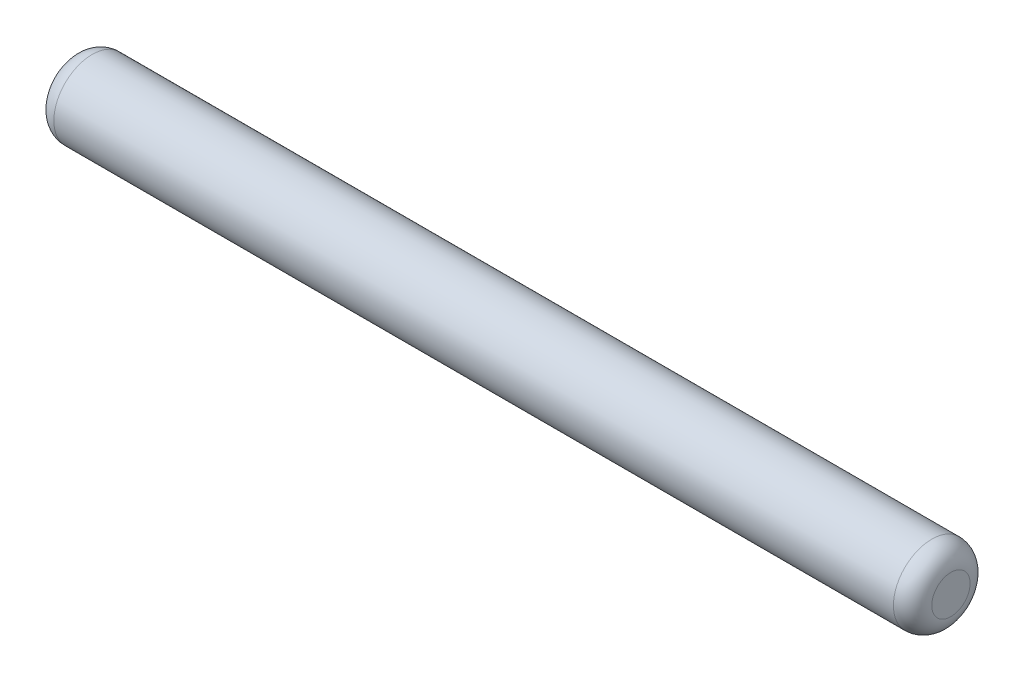
ISO-10303-21;
HEADER;
FILE_DESCRIPTION(('STEP AP214'),'2;1');
FILE_NAME('part.step','',(''),(''),'','','');
FILE_SCHEMA(('AUTOMOTIVE_DESIGN { 1 0 10303 214 1 1 1 1 }'));
ENDSEC;
DATA;
#1=APPLICATION_CONTEXT('core data for automotive mechanical design processes');
#2=APPLICATION_PROTOCOL_DEFINITION('international standard','automotive_design',2000,#1);
#3=PRODUCT_CONTEXT('',#1,'mechanical');
#4=PRODUCT('Part','Part','',(#3));
#5=PRODUCT_RELATED_PRODUCT_CATEGORY('part','',(#4));
#6=PRODUCT_DEFINITION_FORMATION('','',#4);
#7=PRODUCT_DEFINITION_CONTEXT('part definition',#1,'design');
#8=PRODUCT_DEFINITION('design','',#6,#7);
#9=PRODUCT_DEFINITION_SHAPE('','',#8);
#10=(LENGTH_UNIT() NAMED_UNIT(*) SI_UNIT(.MILLI.,.METRE.));
#11=(NAMED_UNIT(*) PLANE_ANGLE_UNIT() SI_UNIT($,.RADIAN.));
#12=(NAMED_UNIT(*) SI_UNIT($,.STERADIAN.) SOLID_ANGLE_UNIT());
#13=UNCERTAINTY_MEASURE_WITH_UNIT(LENGTH_MEASURE(1.E-05),#10,'distance_accuracy_value','');
#14=(GEOMETRIC_REPRESENTATION_CONTEXT(3) GLOBAL_UNCERTAINTY_ASSIGNED_CONTEXT((#13)) GLOBAL_UNIT_ASSIGNED_CONTEXT((#10,
#11,#12)) REPRESENTATION_CONTEXT('',''));
#15=CARTESIAN_POINT('',(0.,0.,0.));
#16=DIRECTION('',(0.,0.,1.));
#17=DIRECTION('',(1.,0.,0.));
#18=AXIS2_PLACEMENT_3D('',#15,#16,#17);
#19=CARTESIAN_POINT('',(-11.45,0.,0.));
#20=DIRECTION('',(1.,0.,0.));
#21=DIRECTION('',(0.,0.,-1.));
#22=AXIS2_PLACEMENT_3D('',#19,#20,#21);
#23=CYLINDRICAL_SURFACE('',#22,1.);
#24=CARTESIAN_POINT('',(-10.95,0.,0.));
#25=DIRECTION('',(1.,0.,0.));
#26=DIRECTION('',(0.,0.,-1.));
#27=AXIS2_PLACEMENT_3D('',#24,#25,#26);
#28=CIRCLE('',#27,1.);
#29=CARTESIAN_POINT('',(-10.95,0.,-1.));
#30=VERTEX_POINT('',#29);
#31=EDGE_CURVE('E55',#30,#30,#28,.T.);
#32=ORIENTED_EDGE('',*,*,#31,.T.);
#33=EDGE_LOOP('',(#32));
#34=FACE_BOUND('',#33,.T.);
#35=CARTESIAN_POINT('',(10.95,0.,0.));
#36=DIRECTION('',(1.,0.,0.));
#37=DIRECTION('',(0.,0.,-1.));
#38=AXIS2_PLACEMENT_3D('',#35,#36,#37);
#39=CIRCLE('',#38,1.);
#40=CARTESIAN_POINT('',(10.95,0.,-1.));
#41=VERTEX_POINT('',#40);
#42=EDGE_CURVE('E59',#41,#41,#39,.F.);
#43=ORIENTED_EDGE('',*,*,#42,.T.);
#44=EDGE_LOOP('',(#43));
#45=FACE_BOUND('',#44,.T.);
#46=ADVANCED_FACE('F44',(#34,#45),#23,.T.);
#47=CARTESIAN_POINT('',(-11.45,0.,0.));
#48=DIRECTION('',(1.,0.,0.));
#49=DIRECTION('',(0.,0.,-1.));
#50=AXIS2_PLACEMENT_3D('',#47,#48,#49);
#51=PLANE('',#50);
#52=CARTESIAN_POINT('',(-11.45,0.,0.));
#53=DIRECTION('',(1.,0.,0.));
#54=DIRECTION('',(0.,0.,-1.));
#55=AXIS2_PLACEMENT_3D('',#52,#53,#54);
#56=CIRCLE('',#55,0.5);
#57=CARTESIAN_POINT('',(-11.45,0.,-0.5));
#58=VERTEX_POINT('',#57);
#59=EDGE_CURVE('E51',#58,#58,#56,.F.);
#60=ORIENTED_EDGE('',*,*,#59,.T.);
#61=EDGE_LOOP('',(#60));
#62=FACE_BOUND('',#61,.T.);
#63=ADVANCED_FACE('F75',(#62),#51,.F.);
#64=CARTESIAN_POINT('',(11.45,0.,0.));
#65=DIRECTION('',(1.,0.,0.));
#66=DIRECTION('',(0.,0.,-1.));
#67=AXIS2_PLACEMENT_3D('',#64,#65,#66);
#68=PLANE('',#67);
#69=CARTESIAN_POINT('',(11.45,0.,0.));
#70=DIRECTION('',(1.,0.,0.));
#71=DIRECTION('',(0.,0.,-1.));
#72=AXIS2_PLACEMENT_3D('',#69,#70,#71);
#73=CIRCLE('',#72,0.5);
#74=CARTESIAN_POINT('',(11.45,0.,-0.5));
#75=VERTEX_POINT('',#74);
#76=EDGE_CURVE('E12',#75,#75,#73,.T.);
#77=ORIENTED_EDGE('',*,*,#76,.T.);
#78=EDGE_LOOP('',(#77));
#79=FACE_BOUND('',#78,.T.);
#80=ADVANCED_FACE('F72',(#79),#68,.T.);
#81=CARTESIAN_POINT('',(-10.95,0.,0.));
#82=DIRECTION('',(1.,0.,0.));
#83=DIRECTION('',(0.,0.,-1.));
#84=AXIS2_PLACEMENT_3D('',#81,#82,#83);
#85=DEGENERATE_TOROIDAL_SURFACE('',#84,0.5,0.5,.T.);
#86=ORIENTED_EDGE('',*,*,#59,.F.);
#87=EDGE_LOOP('',(#86));
#88=FACE_BOUND('',#87,.T.);
#89=ORIENTED_EDGE('',*,*,#31,.F.);
#90=EDGE_LOOP('',(#89));
#91=FACE_BOUND('',#90,.T.);
#92=ADVANCED_FACE('F68',(#88,#91),#85,.T.);
#93=CARTESIAN_POINT('',(10.95,0.,0.));
#94=DIRECTION('',(1.,0.,0.));
#95=DIRECTION('',(0.,0.,-1.));
#96=AXIS2_PLACEMENT_3D('',#93,#94,#95);
#97=DEGENERATE_TOROIDAL_SURFACE('',#96,0.5,0.5,.T.);
#98=ORIENTED_EDGE('',*,*,#42,.F.);
#99=EDGE_LOOP('',(#98));
#100=FACE_BOUND('',#99,.T.);
#101=ORIENTED_EDGE('',*,*,#76,.F.);
#102=EDGE_LOOP('',(#101));
#103=FACE_BOUND('',#102,.T.);
#104=ADVANCED_FACE('F46',(#100,#103),#97,.T.);
#105=CLOSED_SHELL('',(#46,#63,#80,#92,#104));
#106=MANIFOLD_SOLID_BREP('B2',#105);
#107=ADVANCED_BREP_SHAPE_REPRESENTATION('',(#18,#106),#14);
#108=SHAPE_DEFINITION_REPRESENTATION(#9,#107);
ENDSEC;
END-ISO-10303-21;
